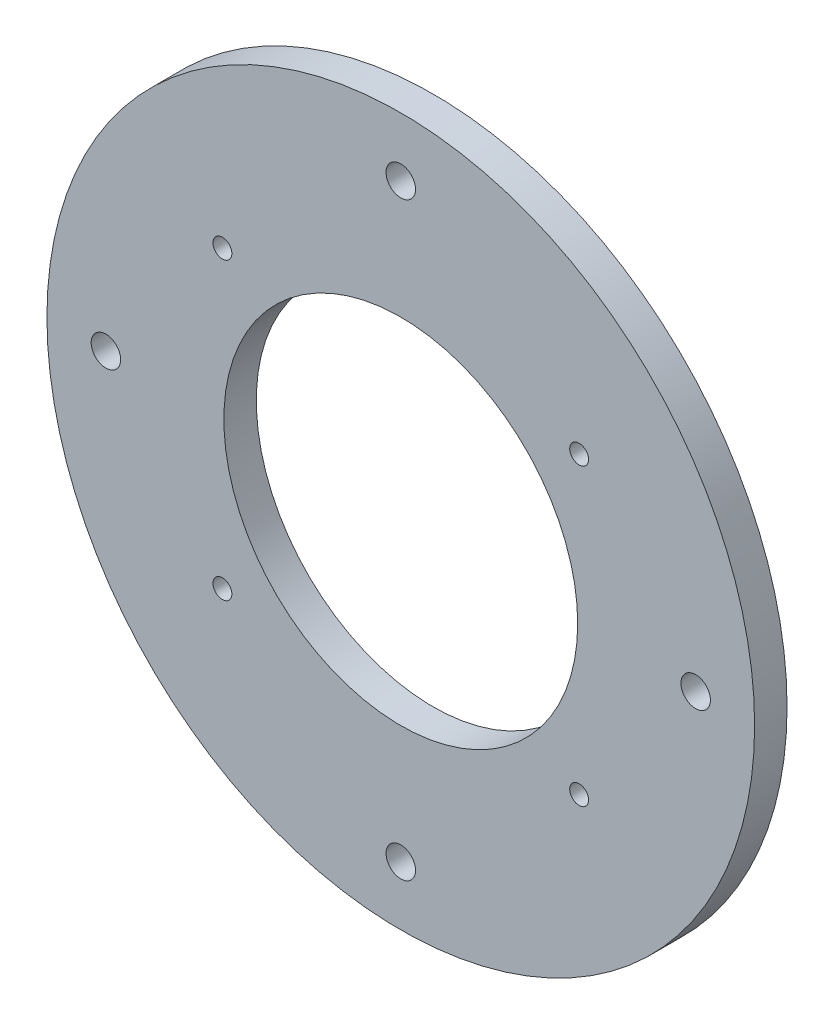
ISO-10303-21;
HEADER;
FILE_DESCRIPTION(('STEP AP214'),'2;1');
FILE_NAME('part.step','',(''),(''),'','','');
FILE_SCHEMA(('AUTOMOTIVE_DESIGN { 1 0 10303 214 1 1 1 1 }'));
ENDSEC;
DATA;
#1=APPLICATION_CONTEXT('core data for automotive mechanical design processes');
#2=APPLICATION_PROTOCOL_DEFINITION('international standard','automotive_design',2000,#1);
#3=PRODUCT_CONTEXT('',#1,'mechanical');
#4=PRODUCT('Part','Part','',(#3));
#5=PRODUCT_RELATED_PRODUCT_CATEGORY('part','',(#4));
#6=PRODUCT_DEFINITION_FORMATION('','',#4);
#7=PRODUCT_DEFINITION_CONTEXT('part definition',#1,'design');
#8=PRODUCT_DEFINITION('design','',#6,#7);
#9=PRODUCT_DEFINITION_SHAPE('','',#8);
#10=(LENGTH_UNIT() NAMED_UNIT(*) SI_UNIT(.MILLI.,.METRE.));
#11=(NAMED_UNIT(*) PLANE_ANGLE_UNIT() SI_UNIT($,.RADIAN.));
#12=(NAMED_UNIT(*) SI_UNIT($,.STERADIAN.) SOLID_ANGLE_UNIT());
#13=UNCERTAINTY_MEASURE_WITH_UNIT(LENGTH_MEASURE(1.E-05),#10,'distance_accuracy_value','');
#14=(GEOMETRIC_REPRESENTATION_CONTEXT(3) GLOBAL_UNCERTAINTY_ASSIGNED_CONTEXT((#13)) GLOBAL_UNIT_ASSIGNED_CONTEXT((#10,
#11,#12)) REPRESENTATION_CONTEXT('',''));
#15=CARTESIAN_POINT('',(0.,0.,0.));
#16=DIRECTION('',(0.,0.,1.));
#17=DIRECTION('',(1.,0.,0.));
#18=AXIS2_PLACEMENT_3D('',#15,#16,#17);
#19=CARTESIAN_POINT('',(0.,0.,5.5));
#20=DIRECTION('',(0.,0.,1.));
#21=DIRECTION('',(1.,0.,0.));
#22=AXIS2_PLACEMENT_3D('',#19,#20,#21);
#23=PLANE('',#22);
#24=CARTESIAN_POINT('',(30.2458399421107,-25.,5.5));
#25=DIRECTION('',(0.,0.,1.));
#26=DIRECTION('',(1.,0.,0.));
#27=AXIS2_PLACEMENT_3D('',#24,#25,#26);
#28=CIRCLE('',#27,1.6);
#29=CARTESIAN_POINT('',(31.8458399421107,-25.,5.5));
#30=VERTEX_POINT('',#29);
#31=EDGE_CURVE('E80',#30,#30,#28,.T.);
#32=ORIENTED_EDGE('',*,*,#31,.F.);
#33=EDGE_LOOP('',(#32));
#34=FACE_BOUND('',#33,.T.);
#35=CARTESIAN_POINT('',(-30.2458399421107,-25.,5.5));
#36=DIRECTION('',(0.,0.,1.));
#37=DIRECTION('',(1.,0.,0.));
#38=AXIS2_PLACEMENT_3D('',#35,#36,#37);
#39=CIRCLE('',#38,1.6);
#40=CARTESIAN_POINT('',(-28.6458399421107,-25.,5.5));
#41=VERTEX_POINT('',#40);
#42=EDGE_CURVE('E86',#41,#41,#39,.T.);
#43=ORIENTED_EDGE('',*,*,#42,.F.);
#44=EDGE_LOOP('',(#43));
#45=FACE_BOUND('',#44,.T.);
#46=CARTESIAN_POINT('',(-30.2458399421107,25.,5.5));
#47=DIRECTION('',(0.,0.,1.));
#48=DIRECTION('',(1.,0.,0.));
#49=AXIS2_PLACEMENT_3D('',#46,#47,#48);
#50=CIRCLE('',#49,1.6);
#51=CARTESIAN_POINT('',(-28.6458399421107,25.,5.5));
#52=VERTEX_POINT('',#51);
#53=EDGE_CURVE('E92',#52,#52,#50,.T.);
#54=ORIENTED_EDGE('',*,*,#53,.F.);
#55=EDGE_LOOP('',(#54));
#56=FACE_BOUND('',#55,.T.);
#57=CARTESIAN_POINT('',(30.2458399421107,25.,5.5));
#58=DIRECTION('',(0.,0.,1.));
#59=DIRECTION('',(1.,0.,0.));
#60=AXIS2_PLACEMENT_3D('',#57,#58,#59);
#61=CIRCLE('',#60,1.6);
#62=CARTESIAN_POINT('',(31.8458399421107,25.,5.5));
#63=VERTEX_POINT('',#62);
#64=EDGE_CURVE('E74',#63,#63,#61,.T.);
#65=ORIENTED_EDGE('',*,*,#64,.F.);
#66=EDGE_LOOP('',(#65));
#67=FACE_BOUND('',#66,.T.);
#68=CARTESIAN_POINT('',(0.,-50.,5.5));
#69=DIRECTION('',(0.,0.,1.));
#70=DIRECTION('',(1.,0.,0.));
#71=AXIS2_PLACEMENT_3D('',#68,#69,#70);
#72=CIRCLE('',#71,2.5);
#73=CARTESIAN_POINT('',(2.50000000000001,-50.,5.5));
#74=VERTEX_POINT('',#73);
#75=EDGE_CURVE('E47',#74,#74,#72,.T.);
#76=ORIENTED_EDGE('',*,*,#75,.F.);
#77=EDGE_LOOP('',(#76));
#78=FACE_BOUND('',#77,.T.);
#79=CARTESIAN_POINT('',(-50.,1.62196645003831E-13,5.5));
#80=DIRECTION('',(0.,0.,1.));
#81=DIRECTION('',(1.,0.,0.));
#82=AXIS2_PLACEMENT_3D('',#79,#80,#81);
#83=CIRCLE('',#82,2.5);
#84=CARTESIAN_POINT('',(-47.5,1.62196645003831E-13,5.5));
#85=VERTEX_POINT('',#84);
#86=EDGE_CURVE('E52',#85,#85,#83,.T.);
#87=ORIENTED_EDGE('',*,*,#86,.F.);
#88=EDGE_LOOP('',(#87));
#89=FACE_BOUND('',#88,.T.);
#90=CARTESIAN_POINT('',(50.,-5.19983361924048E-13,5.5));
#91=DIRECTION('',(0.,0.,1.));
#92=DIRECTION('',(1.,0.,0.));
#93=AXIS2_PLACEMENT_3D('',#90,#91,#92);
#94=CIRCLE('',#93,2.5);
#95=CARTESIAN_POINT('',(52.5,-5.19983361924048E-13,5.5));
#96=VERTEX_POINT('',#95);
#97=EDGE_CURVE('E55',#96,#96,#94,.T.);
#98=ORIENTED_EDGE('',*,*,#97,.F.);
#99=EDGE_LOOP('',(#98));
#100=FACE_BOUND('',#99,.T.);
#101=CARTESIAN_POINT('',(0.,50.,5.5));
#102=DIRECTION('',(0.,0.,1.));
#103=DIRECTION('',(1.,0.,0.));
#104=AXIS2_PLACEMENT_3D('',#101,#102,#103);
#105=CIRCLE('',#104,2.5);
#106=CARTESIAN_POINT('',(2.49999999999999,50.,5.5));
#107=VERTEX_POINT('',#106);
#108=EDGE_CURVE('E58',#107,#107,#105,.T.);
#109=ORIENTED_EDGE('',*,*,#108,.F.);
#110=EDGE_LOOP('',(#109));
#111=FACE_BOUND('',#110,.T.);
#112=CARTESIAN_POINT('',(0.,0.,5.5));
#113=DIRECTION('',(0.,0.,1.));
#114=DIRECTION('',(1.,0.,0.));
#115=AXIS2_PLACEMENT_3D('',#112,#113,#114);
#116=CIRCLE('',#115,60.);
#117=CARTESIAN_POINT('',(60.,0.,5.5));
#118=VERTEX_POINT('',#117);
#119=EDGE_CURVE('E10',#118,#118,#116,.T.);
#120=ORIENTED_EDGE('',*,*,#119,.T.);
#121=EDGE_LOOP('',(#120));
#122=FACE_BOUND('',#121,.T.);
#123=CARTESIAN_POINT('',(0.,0.,5.5));
#124=DIRECTION('',(0.,0.,1.));
#125=DIRECTION('',(1.,0.,0.));
#126=AXIS2_PLACEMENT_3D('',#123,#124,#125);
#127=CIRCLE('',#126,30.);
#128=CARTESIAN_POINT('',(30.,0.,5.5));
#129=VERTEX_POINT('',#128);
#130=EDGE_CURVE('E42',#129,#129,#127,.T.);
#131=ORIENTED_EDGE('',*,*,#130,.F.);
#132=EDGE_LOOP('',(#131));
#133=FACE_BOUND('',#132,.T.);
#134=ADVANCED_FACE('F31',(#34,#45,#56,#67,#78,#89,#100,#111,#122,#133),#23,.T.);
#135=CARTESIAN_POINT('',(0.,0.,0.));
#136=DIRECTION('',(0.,0.,1.));
#137=DIRECTION('',(1.,0.,0.));
#138=AXIS2_PLACEMENT_3D('',#135,#136,#137);
#139=PLANE('',#138);
#140=CARTESIAN_POINT('',(30.2458399421107,-25.,0.));
#141=DIRECTION('',(0.,0.,1.));
#142=DIRECTION('',(1.,0.,0.));
#143=AXIS2_PLACEMENT_3D('',#140,#141,#142);
#144=CIRCLE('',#143,1.6);
#145=CARTESIAN_POINT('',(31.8458399421107,-25.,0.));
#146=VERTEX_POINT('',#145);
#147=EDGE_CURVE('E83',#146,#146,#144,.T.);
#148=ORIENTED_EDGE('',*,*,#147,.T.);
#149=EDGE_LOOP('',(#148));
#150=FACE_BOUND('',#149,.T.);
#151=CARTESIAN_POINT('',(-30.2458399421107,-25.,0.));
#152=DIRECTION('',(0.,0.,1.));
#153=DIRECTION('',(1.,0.,0.));
#154=AXIS2_PLACEMENT_3D('',#151,#152,#153);
#155=CIRCLE('',#154,1.6);
#156=CARTESIAN_POINT('',(-28.6458399421107,-25.,0.));
#157=VERTEX_POINT('',#156);
#158=EDGE_CURVE('E89',#157,#157,#155,.T.);
#159=ORIENTED_EDGE('',*,*,#158,.T.);
#160=EDGE_LOOP('',(#159));
#161=FACE_BOUND('',#160,.T.);
#162=CARTESIAN_POINT('',(-30.2458399421107,25.,0.));
#163=DIRECTION('',(0.,0.,1.));
#164=DIRECTION('',(1.,0.,0.));
#165=AXIS2_PLACEMENT_3D('',#162,#163,#164);
#166=CIRCLE('',#165,1.6);
#167=CARTESIAN_POINT('',(-28.6458399421107,25.,0.));
#168=VERTEX_POINT('',#167);
#169=EDGE_CURVE('E77',#168,#168,#166,.T.);
#170=ORIENTED_EDGE('',*,*,#169,.T.);
#171=EDGE_LOOP('',(#170));
#172=FACE_BOUND('',#171,.T.);
#173=CARTESIAN_POINT('',(30.2458399421107,25.,0.));
#174=DIRECTION('',(0.,0.,1.));
#175=DIRECTION('',(1.,0.,0.));
#176=AXIS2_PLACEMENT_3D('',#173,#174,#175);
#177=CIRCLE('',#176,1.6);
#178=CARTESIAN_POINT('',(31.8458399421107,25.,0.));
#179=VERTEX_POINT('',#178);
#180=EDGE_CURVE('E66',#179,#179,#177,.T.);
#181=ORIENTED_EDGE('',*,*,#180,.T.);
#182=EDGE_LOOP('',(#181));
#183=FACE_BOUND('',#182,.T.);
#184=CARTESIAN_POINT('',(0.,-50.,0.));
#185=DIRECTION('',(0.,0.,1.));
#186=DIRECTION('',(1.,0.,0.));
#187=AXIS2_PLACEMENT_3D('',#184,#185,#186);
#188=CIRCLE('',#187,2.5);
#189=CARTESIAN_POINT('',(2.50000000000001,-50.,0.));
#190=VERTEX_POINT('',#189);
#191=EDGE_CURVE('E61',#190,#190,#188,.T.);
#192=ORIENTED_EDGE('',*,*,#191,.T.);
#193=EDGE_LOOP('',(#192));
#194=FACE_BOUND('',#193,.T.);
#195=CARTESIAN_POINT('',(-50.,1.62196645003831E-13,0.));
#196=DIRECTION('',(0.,0.,1.));
#197=DIRECTION('',(1.,0.,0.));
#198=AXIS2_PLACEMENT_3D('',#195,#196,#197);
#199=CIRCLE('',#198,2.5);
#200=CARTESIAN_POINT('',(-47.5,1.62196645003831E-13,0.));
#201=VERTEX_POINT('',#200);
#202=EDGE_CURVE('E69',#201,#201,#199,.T.);
#203=ORIENTED_EDGE('',*,*,#202,.T.);
#204=EDGE_LOOP('',(#203));
#205=FACE_BOUND('',#204,.T.);
#206=CARTESIAN_POINT('',(50.,-5.19983361924048E-13,0.));
#207=DIRECTION('',(0.,0.,1.));
#208=DIRECTION('',(1.,0.,0.));
#209=AXIS2_PLACEMENT_3D('',#206,#207,#208);
#210=CIRCLE('',#209,2.5);
#211=CARTESIAN_POINT('',(52.5,-5.19983361924048E-13,0.));
#212=VERTEX_POINT('',#211);
#213=EDGE_CURVE('E65',#212,#212,#210,.T.);
#214=ORIENTED_EDGE('',*,*,#213,.T.);
#215=EDGE_LOOP('',(#214));
#216=FACE_BOUND('',#215,.T.);
#217=CARTESIAN_POINT('',(0.,50.,0.));
#218=DIRECTION('',(0.,0.,1.));
#219=DIRECTION('',(1.,0.,0.));
#220=AXIS2_PLACEMENT_3D('',#217,#218,#219);
#221=CIRCLE('',#220,2.5);
#222=CARTESIAN_POINT('',(2.49999999999999,50.,0.));
#223=VERTEX_POINT('',#222);
#224=EDGE_CURVE('E62',#223,#223,#221,.T.);
#225=ORIENTED_EDGE('',*,*,#224,.T.);
#226=EDGE_LOOP('',(#225));
#227=FACE_BOUND('',#226,.T.);
#228=CARTESIAN_POINT('',(0.,0.,0.));
#229=DIRECTION('',(0.,0.,1.));
#230=DIRECTION('',(1.,0.,0.));
#231=AXIS2_PLACEMENT_3D('',#228,#229,#230);
#232=CIRCLE('',#231,60.);
#233=CARTESIAN_POINT('',(60.,0.,0.));
#234=VERTEX_POINT('',#233);
#235=EDGE_CURVE('E35',#234,#234,#232,.T.);
#236=ORIENTED_EDGE('',*,*,#235,.F.);
#237=EDGE_LOOP('',(#236));
#238=FACE_BOUND('',#237,.T.);
#239=CARTESIAN_POINT('',(0.,0.,0.));
#240=DIRECTION('',(0.,0.,1.));
#241=DIRECTION('',(1.,0.,0.));
#242=AXIS2_PLACEMENT_3D('',#239,#240,#241);
#243=CIRCLE('',#242,30.);
#244=CARTESIAN_POINT('',(30.,0.,0.));
#245=VERTEX_POINT('',#244);
#246=EDGE_CURVE('E44',#245,#245,#243,.T.);
#247=ORIENTED_EDGE('',*,*,#246,.T.);
#248=EDGE_LOOP('',(#247));
#249=FACE_BOUND('',#248,.T.);
#250=ADVANCED_FACE('F98',(#150,#161,#172,#183,#194,#205,#216,#227,#238,#249),#139,.F.);
#251=CARTESIAN_POINT('',(0.,0.,5.5));
#252=DIRECTION('',(0.,0.,-1.));
#253=DIRECTION('',(-1.,0.,0.));
#254=AXIS2_PLACEMENT_3D('',#251,#252,#253);
#255=CYLINDRICAL_SURFACE('',#254,60.);
#256=ORIENTED_EDGE('',*,*,#119,.F.);
#257=EDGE_LOOP('',(#256));
#258=FACE_BOUND('',#257,.T.);
#259=ORIENTED_EDGE('',*,*,#235,.T.);
#260=EDGE_LOOP('',(#259));
#261=FACE_BOUND('',#260,.T.);
#262=ADVANCED_FACE('F33',(#258,#261),#255,.T.);
#263=CARTESIAN_POINT('',(0.,0.,5.5));
#264=DIRECTION('',(0.,0.,-1.));
#265=DIRECTION('',(-1.,0.,0.));
#266=AXIS2_PLACEMENT_3D('',#263,#264,#265);
#267=CYLINDRICAL_SURFACE('',#266,30.);
#268=ORIENTED_EDGE('',*,*,#130,.T.);
#269=EDGE_LOOP('',(#268));
#270=FACE_BOUND('',#269,.T.);
#271=ORIENTED_EDGE('',*,*,#246,.F.);
#272=EDGE_LOOP('',(#271));
#273=FACE_BOUND('',#272,.T.);
#274=ADVANCED_FACE('F125',(#270,#273),#267,.F.);
#275=CARTESIAN_POINT('',(0.,50.,0.));
#276=DIRECTION('',(0.,0.,1.));
#277=DIRECTION('',(1.,0.,0.));
#278=AXIS2_PLACEMENT_3D('',#275,#276,#277);
#279=CYLINDRICAL_SURFACE('',#278,2.5);
#280=ORIENTED_EDGE('',*,*,#108,.T.);
#281=EDGE_LOOP('',(#280));
#282=FACE_BOUND('',#281,.T.);
#283=ORIENTED_EDGE('',*,*,#224,.F.);
#284=EDGE_LOOP('',(#283));
#285=FACE_BOUND('',#284,.T.);
#286=ADVANCED_FACE('F128',(#282,#285),#279,.F.);
#287=CARTESIAN_POINT('',(50.,-5.19983361924048E-13,0.));
#288=DIRECTION('',(0.,0.,1.));
#289=DIRECTION('',(1.,0.,0.));
#290=AXIS2_PLACEMENT_3D('',#287,#288,#289);
#291=CYLINDRICAL_SURFACE('',#290,2.5);
#292=ORIENTED_EDGE('',*,*,#97,.T.);
#293=EDGE_LOOP('',(#292));
#294=FACE_BOUND('',#293,.T.);
#295=ORIENTED_EDGE('',*,*,#213,.F.);
#296=EDGE_LOOP('',(#295));
#297=FACE_BOUND('',#296,.T.);
#298=ADVANCED_FACE('F142',(#294,#297),#291,.F.);
#299=CARTESIAN_POINT('',(-50.,1.62196645003831E-13,0.));
#300=DIRECTION('',(0.,0.,1.));
#301=DIRECTION('',(1.,0.,0.));
#302=AXIS2_PLACEMENT_3D('',#299,#300,#301);
#303=CYLINDRICAL_SURFACE('',#302,2.5);
#304=ORIENTED_EDGE('',*,*,#86,.T.);
#305=EDGE_LOOP('',(#304));
#306=FACE_BOUND('',#305,.T.);
#307=ORIENTED_EDGE('',*,*,#202,.F.);
#308=EDGE_LOOP('',(#307));
#309=FACE_BOUND('',#308,.T.);
#310=ADVANCED_FACE('F146',(#306,#309),#303,.F.);
#311=CARTESIAN_POINT('',(0.,-50.,0.));
#312=DIRECTION('',(0.,0.,1.));
#313=DIRECTION('',(1.,0.,0.));
#314=AXIS2_PLACEMENT_3D('',#311,#312,#313);
#315=CYLINDRICAL_SURFACE('',#314,2.5);
#316=ORIENTED_EDGE('',*,*,#75,.T.);
#317=EDGE_LOOP('',(#316));
#318=FACE_BOUND('',#317,.T.);
#319=ORIENTED_EDGE('',*,*,#191,.F.);
#320=EDGE_LOOP('',(#319));
#321=FACE_BOUND('',#320,.T.);
#322=ADVANCED_FACE('F150',(#318,#321),#315,.F.);
#323=CARTESIAN_POINT('',(30.2458399421107,25.,0.));
#324=DIRECTION('',(0.,0.,1.));
#325=DIRECTION('',(1.,0.,0.));
#326=AXIS2_PLACEMENT_3D('',#323,#324,#325);
#327=CYLINDRICAL_SURFACE('',#326,1.6);
#328=ORIENTED_EDGE('',*,*,#180,.F.);
#329=EDGE_LOOP('',(#328));
#330=FACE_BOUND('',#329,.T.);
#331=ORIENTED_EDGE('',*,*,#64,.T.);
#332=EDGE_LOOP('',(#331));
#333=FACE_BOUND('',#332,.T.);
#334=ADVANCED_FACE('F105',(#330,#333),#327,.F.);
#335=CARTESIAN_POINT('',(-30.2458399421107,25.,0.));
#336=DIRECTION('',(0.,0.,1.));
#337=DIRECTION('',(1.,0.,0.));
#338=AXIS2_PLACEMENT_3D('',#335,#336,#337);
#339=CYLINDRICAL_SURFACE('',#338,1.6);
#340=ORIENTED_EDGE('',*,*,#169,.F.);
#341=EDGE_LOOP('',(#340));
#342=FACE_BOUND('',#341,.T.);
#343=ORIENTED_EDGE('',*,*,#53,.T.);
#344=EDGE_LOOP('',(#343));
#345=FACE_BOUND('',#344,.T.);
#346=ADVANCED_FACE('F101',(#342,#345),#339,.F.);
#347=CARTESIAN_POINT('',(-30.2458399421107,-25.,0.));
#348=DIRECTION('',(0.,0.,1.));
#349=DIRECTION('',(1.,0.,0.));
#350=AXIS2_PLACEMENT_3D('',#347,#348,#349);
#351=CYLINDRICAL_SURFACE('',#350,1.6);
#352=ORIENTED_EDGE('',*,*,#158,.F.);
#353=EDGE_LOOP('',(#352));
#354=FACE_BOUND('',#353,.T.);
#355=ORIENTED_EDGE('',*,*,#42,.T.);
#356=EDGE_LOOP('',(#355));
#357=FACE_BOUND('',#356,.T.);
#358=ADVANCED_FACE('F104',(#354,#357),#351,.F.);
#359=CARTESIAN_POINT('',(30.2458399421107,-25.,0.));
#360=DIRECTION('',(0.,0.,1.));
#361=DIRECTION('',(1.,0.,0.));
#362=AXIS2_PLACEMENT_3D('',#359,#360,#361);
#363=CYLINDRICAL_SURFACE('',#362,1.6);
#364=ORIENTED_EDGE('',*,*,#147,.F.);
#365=EDGE_LOOP('',(#364));
#366=FACE_BOUND('',#365,.T.);
#367=ORIENTED_EDGE('',*,*,#31,.T.);
#368=EDGE_LOOP('',(#367));
#369=FACE_BOUND('',#368,.T.);
#370=ADVANCED_FACE('F158',(#366,#369),#363,.F.);
#371=CLOSED_SHELL('',(#134,#250,#262,#274,#286,#298,#310,#322,#334,#346,#358,#370));
#372=MANIFOLD_SOLID_BREP('B2',#371);
#373=ADVANCED_BREP_SHAPE_REPRESENTATION('',(#18,#372),#14);
#374=SHAPE_DEFINITION_REPRESENTATION(#9,#373);
ENDSEC;
END-ISO-10303-21;
